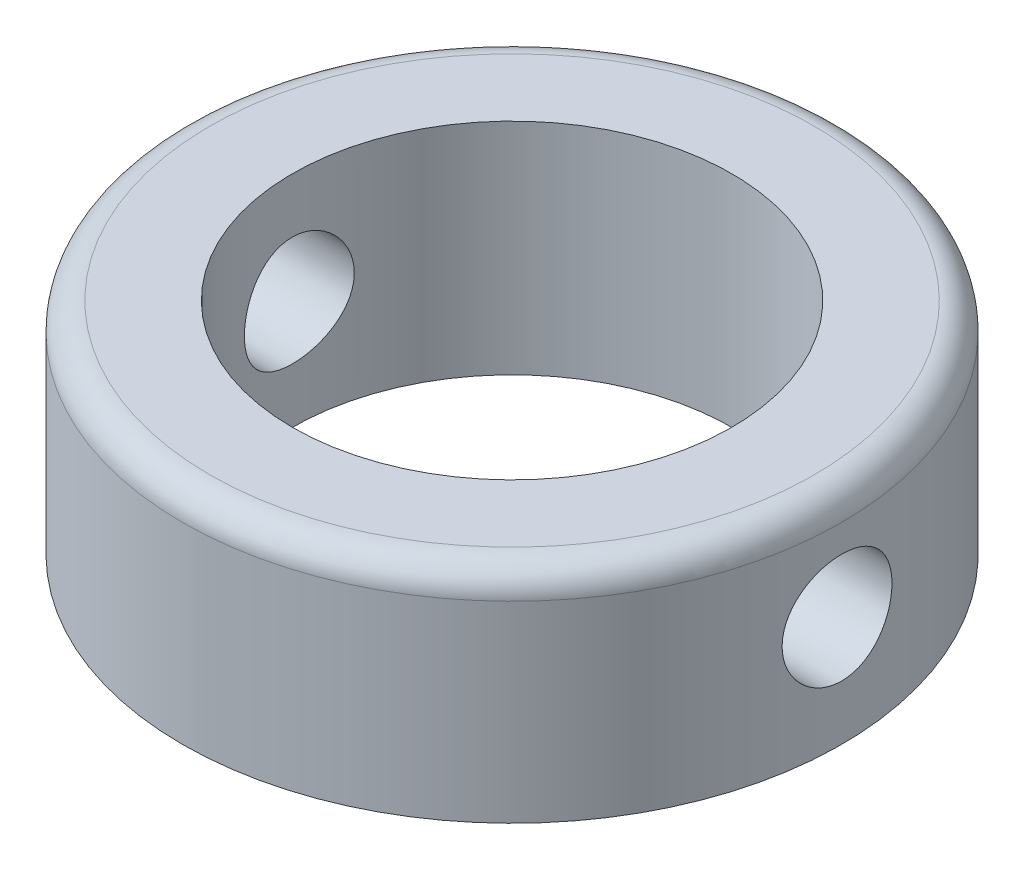
ISO-10303-21;
HEADER;
FILE_DESCRIPTION(('STEP AP214'),'2;1');
FILE_NAME('part.step','',(''),(''),'','','');
FILE_SCHEMA(('AUTOMOTIVE_DESIGN { 1 0 10303 214 1 1 1 1 }'));
ENDSEC;
DATA;
#1=APPLICATION_CONTEXT('core data for automotive mechanical design processes');
#2=APPLICATION_PROTOCOL_DEFINITION('international standard','automotive_design',2000,#1);
#3=PRODUCT_CONTEXT('',#1,'mechanical');
#4=PRODUCT('Part','Part','',(#3));
#5=PRODUCT_RELATED_PRODUCT_CATEGORY('part','',(#4));
#6=PRODUCT_DEFINITION_FORMATION('','',#4);
#7=PRODUCT_DEFINITION_CONTEXT('part definition',#1,'design');
#8=PRODUCT_DEFINITION('design','',#6,#7);
#9=PRODUCT_DEFINITION_SHAPE('','',#8);
#10=(LENGTH_UNIT() NAMED_UNIT(*) SI_UNIT(.MILLI.,.METRE.));
#11=(NAMED_UNIT(*) PLANE_ANGLE_UNIT() SI_UNIT($,.RADIAN.));
#12=(NAMED_UNIT(*) SI_UNIT($,.STERADIAN.) SOLID_ANGLE_UNIT());
#13=UNCERTAINTY_MEASURE_WITH_UNIT(LENGTH_MEASURE(1.E-05),#10,'distance_accuracy_value','');
#14=(GEOMETRIC_REPRESENTATION_CONTEXT(3) GLOBAL_UNCERTAINTY_ASSIGNED_CONTEXT((#13)) GLOBAL_UNIT_ASSIGNED_CONTEXT((#10,
#11,#12)) REPRESENTATION_CONTEXT('',''));
#15=CARTESIAN_POINT('',(0.,0.,0.));
#16=DIRECTION('',(0.,0.,1.));
#17=DIRECTION('',(1.,0.,0.));
#18=AXIS2_PLACEMENT_3D('',#15,#16,#17);
#19=CARTESIAN_POINT('',(0.,8.,0.));
#20=DIRECTION('',(0.,1.,0.));
#21=DIRECTION('',(0.,0.,1.));
#22=AXIS2_PLACEMENT_3D('',#19,#20,#21);
#23=PLANE('',#22);
#24=CARTESIAN_POINT('',(0.,8.,0.));
#25=DIRECTION('',(0.,1.,0.));
#26=DIRECTION('',(0.,0.,1.));
#27=AXIS2_PLACEMENT_3D('',#24,#25,#26);
#28=CIRCLE('',#27,11.);
#29=CARTESIAN_POINT('',(0.,8.,11.));
#30=VERTEX_POINT('',#29);
#31=EDGE_CURVE('E50',#30,#30,#28,.T.);
#32=ORIENTED_EDGE('',*,*,#31,.T.);
#33=EDGE_LOOP('',(#32));
#34=FACE_BOUND('',#33,.T.);
#35=CARTESIAN_POINT('',(0.,8.,0.));
#36=DIRECTION('',(0.,1.,0.));
#37=DIRECTION('',(0.,0.,1.));
#38=AXIS2_PLACEMENT_3D('',#35,#36,#37);
#39=CIRCLE('',#38,8.);
#40=CARTESIAN_POINT('',(0.,8.,8.));
#41=VERTEX_POINT('',#40);
#42=EDGE_CURVE('E104',#41,#41,#39,.T.);
#43=ORIENTED_EDGE('',*,*,#42,.F.);
#44=EDGE_LOOP('',(#43));
#45=FACE_BOUND('',#44,.T.);
#46=ADVANCED_FACE('F37',(#34,#45),#23,.T.);
#47=CARTESIAN_POINT('',(0.,0.,0.));
#48=DIRECTION('',(0.,1.,0.));
#49=DIRECTION('',(0.,0.,1.));
#50=AXIS2_PLACEMENT_3D('',#47,#48,#49);
#51=PLANE('',#50);
#52=CARTESIAN_POINT('',(0.,0.,0.));
#53=DIRECTION('',(0.,1.,0.));
#54=DIRECTION('',(0.,0.,1.));
#55=AXIS2_PLACEMENT_3D('',#52,#53,#54);
#56=CIRCLE('',#55,12.);
#57=CARTESIAN_POINT('',(0.,0.,12.));
#58=VERTEX_POINT('',#57);
#59=EDGE_CURVE('E55',#58,#58,#56,.T.);
#60=ORIENTED_EDGE('',*,*,#59,.F.);
#61=EDGE_LOOP('',(#60));
#62=FACE_BOUND('',#61,.T.);
#63=CARTESIAN_POINT('',(0.,0.,0.));
#64=DIRECTION('',(0.,1.,0.));
#65=DIRECTION('',(0.,0.,1.));
#66=AXIS2_PLACEMENT_3D('',#63,#64,#65);
#67=CIRCLE('',#66,8.);
#68=CARTESIAN_POINT('',(0.,0.,8.));
#69=VERTEX_POINT('',#68);
#70=EDGE_CURVE('E106',#69,#69,#67,.T.);
#71=ORIENTED_EDGE('',*,*,#70,.T.);
#72=EDGE_LOOP('',(#71));
#73=FACE_BOUND('',#72,.T.);
#74=ADVANCED_FACE('F90',(#62,#73),#51,.F.);
#75=CARTESIAN_POINT('',(0.,8.,0.));
#76=DIRECTION('',(0.,-1.,0.));
#77=DIRECTION('',(0.,0.,-1.));
#78=AXIS2_PLACEMENT_3D('',#75,#76,#77);
#79=CYLINDRICAL_SURFACE('',#78,12.);
#80=CARTESIAN_POINT('',(-12.,2.,0.));
#81=CARTESIAN_POINT('',(-11.9999980893506,2.00000447115825,-0.111512723966572));
#82=CARTESIAN_POINT('',(-11.9984294233043,2.00935781997514,-0.223086305471057));
#83=CARTESIAN_POINT('',(-11.9923227595311,2.04650852701226,-0.443104177338434));
#84=CARTESIAN_POINT('',(-11.9877820313911,2.07432284552928,-0.551545494367397));
#85=CARTESIAN_POINT('',(-11.9762405458916,2.1475323588742,-0.762083797770115));
#86=CARTESIAN_POINT('',(-11.9692418012735,2.19291317251246,-0.86418589474552));
#87=CARTESIAN_POINT('',(-11.9535538166566,2.29992983364192,-1.05931347358236));
#88=CARTESIAN_POINT('',(-11.9448647700355,2.3615638219864,-1.15233999190287));
#89=CARTESIAN_POINT('',(-11.9266665396665,2.49996406705637,-1.32757809143334));
#90=CARTESIAN_POINT('',(-11.9171509745189,2.5768552917089,-1.40969032282797));
#91=CARTESIAN_POINT('',(-11.8984210150139,2.74331837477825,-1.55991079892794));
#92=CARTESIAN_POINT('',(-11.8892066397013,2.83289103316529,-1.62801815951278));
#93=CARTESIAN_POINT('',(-11.8720605260782,3.02285677295764,-1.74869370048411));
#94=CARTESIAN_POINT('',(-11.8641370327331,3.1233130694438,-1.8011636422888));
#95=CARTESIAN_POINT('',(-11.8505583183574,3.3317676514405,-1.88844669232898));
#96=CARTESIAN_POINT('',(-11.8449029441145,3.4397654269421,-1.92326099325249));
#97=CARTESIAN_POINT('',(-11.836564294742,3.65918421988523,-1.97393150222785));
#98=CARTESIAN_POINT('',(-11.8338541478856,3.77056458920111,-1.98995922330832));
#99=CARTESIAN_POINT('',(-11.8316315114932,3.99446422150678,-2.0031333802319));
#100=CARTESIAN_POINT('',(-11.8321187956577,4.10698340333384,-2.0002811523112));
#101=CARTESIAN_POINT('',(-11.8362114309084,4.32874228902036,-1.97591607871692));
#102=CARTESIAN_POINT('',(-11.8397845865513,4.43800384283619,-1.95459590551182));
#103=CARTESIAN_POINT('',(-11.8495959616881,4.65137705426331,-1.89420251232276));
#104=CARTESIAN_POINT('',(-11.8558342725862,4.75548853511084,-1.85512868345579));
#105=CARTESIAN_POINT('',(-11.8703078346728,4.95618305875274,-1.76014179687513));
#106=CARTESIAN_POINT('',(-11.8785525368586,5.05272752486498,-1.70414873110377));
#107=CARTESIAN_POINT('',(-11.8961033473201,5.23512352043071,-1.57696961404595));
#108=CARTESIAN_POINT('',(-11.9054095412343,5.32097418596394,-1.50578233652343));
#109=CARTESIAN_POINT('',(-11.9241762230383,5.48066086864588,-1.34918576972724));
#110=CARTESIAN_POINT('',(-11.9336371938532,5.55433481483207,-1.2636111710985));
#111=CARTESIAN_POINT('',(-11.9515408111738,5.68630221013227,-1.08122819918532));
#112=CARTESIAN_POINT('',(-11.959983451118,5.74459556014658,-0.984419753525137));
#113=CARTESIAN_POINT('',(-11.9749111431433,5.84416178170903,-0.782164732933369));
#114=CARTESIAN_POINT('',(-11.9813945472596,5.885420335465,-0.676710980451729));
#115=CARTESIAN_POINT('',(-11.9916600241013,5.94959537219678,-0.460238676482185));
#116=CARTESIAN_POINT('',(-11.9954423228038,5.97251338957897,-0.349220591343574));
#117=CARTESIAN_POINT('',(-11.9998490387415,5.99913708676891,-0.126167921041299));
#118=CARTESIAN_POINT('',(-12.0005100241023,6.00306525744449,-0.0141605897208089));
#119=CARTESIAN_POINT('',(-11.9986997953694,5.9921909244575,0.20891181831191));
#120=CARTESIAN_POINT('',(-11.9962287017929,5.97738914149301,0.319976931113631));
#121=CARTESIAN_POINT('',(-11.9884546155056,5.92966012053162,0.537324940437411));
#122=CARTESIAN_POINT('',(-11.9831688384105,5.8968430332879,0.643632694708304));
#123=CARTESIAN_POINT('',(-11.9703557156429,5.81413238544037,0.849237507888354));
#124=CARTESIAN_POINT('',(-11.9628282440962,5.76423786589178,0.948534172727775));
#125=CARTESIAN_POINT('',(-11.9462761304193,5.64827910024257,1.13826455157517));
#126=CARTESIAN_POINT('',(-11.9372388470962,5.5820758750662,1.22861220074972));
#127=CARTESIAN_POINT('',(-11.9187077391352,5.43557014769195,1.39699486840215));
#128=CARTESIAN_POINT('',(-11.9092138813724,5.35526662137866,1.47502899175727));
#129=CARTESIAN_POINT('',(-11.8907214018868,5.18184196154286,1.6173942237264));
#130=CARTESIAN_POINT('',(-11.8817289290968,5.08859666758847,1.68157500889097));
#131=CARTESIAN_POINT('',(-11.8653722382231,4.89251762468917,1.79336184823599));
#132=CARTESIAN_POINT('',(-11.8580079685282,4.78968417981801,1.84096842781586));
#133=CARTESIAN_POINT('',(-11.8457876295816,4.57776821375029,1.91803066517852));
#134=CARTESIAN_POINT('',(-11.8409212344885,4.46871352397561,1.94756114603836));
#135=CARTESIAN_POINT('',(-11.8342217346821,4.24710389662259,1.98786836302262));
#136=CARTESIAN_POINT('',(-11.8323883662618,4.13454926421436,1.99864672955693));
#137=CARTESIAN_POINT('',(-11.8319738646721,3.91063586723007,2.00109829283788));
#138=CARTESIAN_POINT('',(-11.8333524520452,3.79927969713977,1.99300810890015));
#139=CARTESIAN_POINT('',(-11.8391182516298,3.57953660155939,1.95846387116548));
#140=CARTESIAN_POINT('',(-11.8435054540897,3.4711496664465,1.93200987688998));
#141=CARTESIAN_POINT('',(-11.8547788502538,3.26051325016591,1.86157959167592));
#142=CARTESIAN_POINT('',(-11.8616621377574,3.15825679195518,1.81762367248035));
#143=CARTESIAN_POINT('',(-11.8771549513777,2.96253146464412,1.71346160313273));
#144=CARTESIAN_POINT('',(-11.8857645631072,2.86906303170229,1.65325464699885));
#145=CARTESIAN_POINT('',(-11.903867632365,2.6923715335138,1.51745510749772));
#146=CARTESIAN_POINT('',(-11.9133703646104,2.60928318663978,1.44168845087492));
#147=CARTESIAN_POINT('',(-11.9321149788867,2.45691871642005,1.27728722510418));
#148=CARTESIAN_POINT('',(-11.9413568002124,2.38764578508946,1.18864969033011));
#149=CARTESIAN_POINT('',(-11.9586122371378,2.26444138544004,1.00029533571222));
#150=CARTESIAN_POINT('',(-11.9666169300248,2.21061916854964,0.900506230026254));
#151=CARTESIAN_POINT('',(-11.9804093408142,2.12058441231206,0.693210455503184));
#152=CARTESIAN_POINT('',(-11.9861992654199,2.08435433513624,0.585711595864007));
#153=CARTESIAN_POINT('',(-11.9936463266636,2.03839578069867,0.39816264803632));
#154=CARTESIAN_POINT('',(-11.9960162181869,2.02402042430723,0.319247064238758));
#155=CARTESIAN_POINT('',(-11.999193727889,2.0048210097242,0.160231448255847));
#156=CARTESIAN_POINT('',(-12.0000013729651,1.99999678709011,0.0801314364867953));
#157=CARTESIAN_POINT('',(-12.,2.,0.));
#158=B_SPLINE_CURVE_WITH_KNOTS('',3,(#80,#81,#82,#83,#84,#85,#86,#87,#88,#89,#90,#91,#92,#93,
#94,#95,#96,#97,#98,#99,#100,#101,#102,#103,#104,#105,#106,#107,#108,#109,#110,#111,#112,#113,
#114,#115,#116,#117,#118,#119,#120,#121,#122,#123,#124,#125,#126,#127,#128,#129,#130,#131,#132,
#133,#134,#135,#136,#137,#138,#139,#140,#141,#142,#143,#144,#145,#146,#147,#148,#149,#150,#151,
#152,#153,#154,#155,#156,#157),.UNSPECIFIED.,.T.,.F.,(4,2,2,2,2,2,2,2,2,2,2,2,2,2,2,2,2,2,2,2,2,
2,2,2,2,2,2,2,2,2,2,2,2,2,2,2,2,2,4),(0.,0.334245267950807,0.668798036556336,1.00307749362022,
1.33731873013983,1.67441992849866,2.01154240135885,2.35074016659072,2.68991501500945,
3.02596861682739,3.36199843456709,3.69456417408327,4.02714132020305,4.36131645306046,
4.69551856544459,5.03386215929061,5.37220793308678,5.71083751132723,6.04943875616919,
6.38406306793118,6.71867450428688,7.05126245605133,7.38386908660853,7.71941460501619,
8.05498450443427,8.39403057606095,8.73306589900755,9.07068817873418,9.40828110229294,
9.7416632761816,10.0750443695051,10.4080385458098,10.7410492402347,11.0780110735471,
11.4150506710318,11.7544178528576,12.0934460170406,12.3336339853121,12.5738178182157),.UNSPECIFIED.);
#159=CARTESIAN_POINT('',(-12.,2.,0.));
#160=VERTEX_POINT('',#159);
#161=EDGE_CURVE('E81',#160,#160,#158,.T.);
#162=ORIENTED_EDGE('',*,*,#161,.T.);
#163=EDGE_LOOP('',(#162));
#164=FACE_BOUND('',#163,.T.);
#165=CARTESIAN_POINT('',(11.8321595661992,4.,-2.));
#166=CARTESIAN_POINT('',(11.8321615789328,3.88849940147055,-1.99999551873586));
#167=CARTESIAN_POINT('',(11.8337527390819,3.77693791514282,-1.99064413522263));
#168=CARTESIAN_POINT('',(11.8399396576003,3.55694516538947,-1.9535019424531));
#169=CARTESIAN_POINT('',(11.844538186771,3.44851688499355,-1.92569412824689));
#170=CARTESIAN_POINT('',(11.8562048749385,3.23800617332672,-1.8525036349364));
#171=CARTESIAN_POINT('',(11.8632709694721,3.1359185210702,-1.80713564394559));
#172=CARTESIAN_POINT('',(11.8790741768183,2.94081523622578,-1.70014919751157));
#173=CARTESIAN_POINT('',(11.8878111015538,2.84779858433814,-1.63853257080106));
#174=CARTESIAN_POINT('',(11.906067769247,2.67254972020435,-1.50015002157323));
#175=CARTESIAN_POINT('',(11.9155937386236,2.59041989489103,-1.42325523914587));
#176=CARTESIAN_POINT('',(11.9342998453486,2.44016535451055,-1.25677760375622));
#177=CARTESIAN_POINT('',(11.9434799621739,2.37204146950767,-1.16719399931998));
#178=CARTESIAN_POINT('',(11.9605258958617,2.25134834622458,-0.977218295958686));
#179=CARTESIAN_POINT('',(11.9683835394587,2.19887439381456,-0.876764865165368));
#180=CARTESIAN_POINT('',(11.9818298956567,2.11158314357556,-0.668316497379095));
#181=CARTESIAN_POINT('',(11.9874187557813,2.0767646976921,-0.560322051262551));
#182=CARTESIAN_POINT('',(11.9956538777952,2.02608597201288,-0.340914981075394));
#183=CARTESIAN_POINT('',(11.9983268248873,2.01005366719625,-0.229543109343417));
#184=CARTESIAN_POINT('',(12.0005206347422,1.99686739667792,-0.00566022842063817));
#185=CARTESIAN_POINT('',(12.0000417117545,1.99971214780221,0.106850702823118));
#186=CARTESIAN_POINT('',(11.9960068674511,2.02406508122257,0.3286417480631));
#187=CARTESIAN_POINT('',(11.9924814695392,2.04538813072732,0.437942824560112));
#188=CARTESIAN_POINT('',(11.9827838301731,2.10580085939719,0.651393583689433));
#189=CARTESIAN_POINT('',(11.9766115081057,2.1448910796716,0.755543109321203));
#190=CARTESIAN_POINT('',(11.9622615880957,2.23991251225226,0.956284918226118));
#191=CARTESIAN_POINT('',(11.954074938615,2.29592000966595,1.05284041841524));
#192=CARTESIAN_POINT('',(11.936605904572,2.42313025810804,1.23525242387731));
#193=CARTESIAN_POINT('',(11.9273234313531,2.49433423896865,1.3211080623327));
#194=CARTESIAN_POINT('',(11.9085621458608,2.65094304529545,1.48077701875733));
#195=CARTESIAN_POINT('',(11.8990823178483,2.73650967592079,1.55443160180257));
#196=CARTESIAN_POINT('',(11.8811036782784,2.91886967217266,1.68636367075845));
#197=CARTESIAN_POINT('',(11.8726048757706,3.01566314134626,1.74464101482593));
#198=CARTESIAN_POINT('',(11.8575500364945,3.21791331350198,1.84419554759063));
#199=CARTESIAN_POINT('',(11.8509961864208,3.32337959847367,1.88545362182339));
#200=CARTESIAN_POINT('',(11.840609509519,3.53987925784603,1.94962389665249));
#201=CARTESIAN_POINT('',(11.8367764431066,3.65091214114594,1.97253771261436));
#202=CARTESIAN_POINT('',(11.8323116753769,3.87397292492971,1.99914550790341));
#203=CARTESIAN_POINT('',(11.8316422860694,3.98597310376168,2.00306576632995));
#204=CARTESIAN_POINT('',(11.8334802782589,4.20902933735266,1.99217816214597));
#205=CARTESIAN_POINT('',(11.8359875370548,4.32008542841118,1.97737102289973));
#206=CARTESIAN_POINT('',(11.8438614996401,4.53738220735269,1.92964186794248));
#207=CARTESIAN_POINT('',(11.8492100153468,4.64364891190241,1.89683503251711));
#208=CARTESIAN_POINT('',(11.862148584044,4.84917613302359,1.81415855215382));
#209=CARTESIAN_POINT('',(11.8697387711246,4.94843623004072,1.76428788648075));
#210=CARTESIAN_POINT('',(11.8863930271791,5.13813967552489,1.64836533858338));
#211=CARTESIAN_POINT('',(11.8954700448028,5.22849325820485,1.58216845132749));
#212=CARTESIAN_POINT('',(11.9140373334389,5.396890826156,1.43567157256639));
#213=CARTESIAN_POINT('',(11.9235276334827,5.47493394488779,1.35537058910724));
#214=CARTESIAN_POINT('',(11.9419713769461,5.61732151418296,1.18194245626305));
#215=CARTESIAN_POINT('',(11.9509182107574,5.68151506102763,1.08869060270896));
#216=CARTESIAN_POINT('',(11.9671608994635,5.7933242616039,0.892594758359461));
#217=CARTESIAN_POINT('',(11.9744568077598,5.84094045157908,0.789751077976502));
#218=CARTESIAN_POINT('',(11.9865468653567,5.91800846716389,0.577839241201063));
#219=CARTESIAN_POINT('',(11.9913518765409,5.94753926058794,0.46880045008209));
#220=CARTESIAN_POINT('',(11.9979646653543,5.98785247917106,0.24722458789937));
#221=CARTESIAN_POINT('',(11.9997726896015,5.99863644698588,0.134687805457297));
#222=CARTESIAN_POINT('',(12.0001843031025,6.00110550584976,-0.0892330206189404));
#223=CARTESIAN_POINT('',(11.9988264161935,5.99302020315287,-0.200614528482131));
#224=CARTESIAN_POINT('',(11.9931374270987,5.95847686218446,-0.420409579451763));
#225=CARTESIAN_POINT('',(11.9888063415615,5.93201892679226,-0.528823139173983));
#226=CARTESIAN_POINT('',(11.9776559106192,5.86156946756508,-0.73951715673483));
#227=CARTESIAN_POINT('',(11.970839336327,5.81759746543196,-0.841804297723056));
#228=CARTESIAN_POINT('',(11.9554620550242,5.71339365101553,-1.03758436238573));
#229=CARTESIAN_POINT('',(11.9469012653393,5.65316106795004,-1.13107686889458));
#230=CARTESIAN_POINT('',(11.9288610369313,5.5173319260316,-1.30777035642112));
#231=CARTESIAN_POINT('',(11.919372196329,5.441567236199,-1.3908411444822));
#232=CARTESIAN_POINT('',(11.900610426515,5.27717735367695,-1.54317110076073));
#233=CARTESIAN_POINT('',(11.8913375483961,5.18854915286998,-1.61242702936952));
#234=CARTESIAN_POINT('',(11.8739867482713,5.00020374200831,-1.73561141672869));
#235=CARTESIAN_POINT('',(11.8659177427663,4.90041252818761,-1.78942799124616));
#236=CARTESIAN_POINT('',(11.8519936807305,4.69311261132948,-1.87945162912342));
#237=CARTESIAN_POINT('',(11.846136413799,4.58561174185811,-1.91567628417846));
#238=CARTESIAN_POINT('',(11.8385979588519,4.39807698441009,-1.96162084250194));
#239=CARTESIAN_POINT('',(11.8361969873557,4.31917855362991,-1.97598993413711));
#240=CARTESIAN_POINT('',(11.8329770823046,4.16019721213045,-1.99518103614505));
#241=CARTESIAN_POINT('',(11.8321581200295,4.08011432294064,-2.00000321983422));
#242=CARTESIAN_POINT('',(11.8321595661992,4.,-2.));
#243=B_SPLINE_CURVE_WITH_KNOTS('',3,(#165,#166,#167,#168,#169,#170,#171,#172,#173,#174,#175,
#176,#177,#178,#179,#180,#181,#182,#183,#184,#185,#186,#187,#188,#189,#190,#191,#192,#193,#194,
#195,#196,#197,#198,#199,#200,#201,#202,#203,#204,#205,#206,#207,#208,#209,#210,#211,#212,#213,
#214,#215,#216,#217,#218,#219,#220,#221,#222,#223,#224,#225,#226,#227,#228,#229,#230,#231,#232,
#233,#234,#235,#236,#237,#238,#239,#240,#241,#242),.UNSPECIFIED.,.T.,.F.,(4,2,2,2,2,2,2,2,2,2,2,
2,2,2,2,2,2,2,2,2,2,2,2,2,2,2,2,2,2,2,2,2,2,2,2,2,2,2,4),(0.,0.334208831142192,
0.668726015970375,1.00296399830015,1.33716437924219,1.67431327324572,2.01148214267558,
2.35066384089148,2.6898234808889,3.02585253978052,3.36185875722154,3.69453696931735,
4.02722531399626,4.3614368331154,4.69567540981411,5.03396898769699,5.37226568596815,
5.71094129998883,6.04958708750462,6.38418833936328,6.71877666731181,7.05124851708393,
7.3837402583486,7.71929874210162,8.05488083544551,8.39395290428305,8.73301400381358,
9.07058387534117,9.40812596729881,9.74158221012733,10.0750365857506,10.4081203186597,
10.7412198431387,11.078135979706,11.4151310310545,11.7545098209466,12.0935485339556,
12.3336853643501,12.5738178352145),.UNSPECIFIED.);
#244=CARTESIAN_POINT('',(11.8321595661992,4.,-2.));
#245=VERTEX_POINT('',#244);
#246=EDGE_CURVE('E76',#245,#245,#243,.T.);
#247=ORIENTED_EDGE('',*,*,#246,.T.);
#248=EDGE_LOOP('',(#247));
#249=FACE_BOUND('',#248,.T.);
#250=CARTESIAN_POINT('',(0.,7.,0.));
#251=DIRECTION('',(0.,1.,0.));
#252=DIRECTION('',(0.,0.,1.));
#253=AXIS2_PLACEMENT_3D('',#250,#251,#252);
#254=CIRCLE('',#253,12.);
#255=CARTESIAN_POINT('',(0.,7.,12.));
#256=VERTEX_POINT('',#255);
#257=EDGE_CURVE('E10',#256,#256,#254,.F.);
#258=ORIENTED_EDGE('',*,*,#257,.T.);
#259=EDGE_LOOP('',(#258));
#260=FACE_BOUND('',#259,.T.);
#261=ORIENTED_EDGE('',*,*,#59,.T.);
#262=EDGE_LOOP('',(#261));
#263=FACE_BOUND('',#262,.T.);
#264=ADVANCED_FACE('F86',(#164,#249,#260,#263),#79,.T.);
#265=CARTESIAN_POINT('',(0.,8.,0.));
#266=DIRECTION('',(0.,-1.,0.));
#267=DIRECTION('',(0.,0.,-1.));
#268=AXIS2_PLACEMENT_3D('',#265,#266,#267);
#269=CYLINDRICAL_SURFACE('',#268,8.);
#270=CARTESIAN_POINT('',(-7.74596669241483,4.,-2.));
#271=CARTESIAN_POINT('',(-7.74596880070288,4.11044060074126,-1.99999686287446));
#272=CARTESIAN_POINT('',(-7.74835444811678,4.22091591894282,-1.99082099639812));
#273=CARTESIAN_POINT('',(-7.75761489594051,4.43869406253881,-1.95441850037103));
#274=CARTESIAN_POINT('',(-7.76449230897304,4.54599500357455,-1.92718136539368));
#275=CARTESIAN_POINT('',(-7.7819097967692,4.75424283054975,-1.85559295970563));
#276=CARTESIAN_POINT('',(-7.79244514152366,4.85519772430857,-1.81126378228359));
#277=CARTESIAN_POINT('',(-7.81598553623007,5.0482486820319,-1.70681691300911));
#278=CARTESIAN_POINT('',(-7.82899069102791,5.14034436966417,-1.64669855084855));
#279=CARTESIAN_POINT('',(-7.856325730845,5.31508931620977,-1.5109667418495));
#280=CARTESIAN_POINT('',(-7.87067678098427,5.39751488028004,-1.43506951016324));
#281=CARTESIAN_POINT('',(-7.89890300412235,5.54860911548827,-1.27054565128053));
#282=CARTESIAN_POINT('',(-7.91277813253111,5.6172765004974,-1.18191783534424));
#283=CARTESIAN_POINT('',(-7.93872332416466,5.73982037410502,-0.992916160863163));
#284=CARTESIAN_POINT('',(-7.95076549920474,5.79347711052917,-0.892395660956095));
#285=CARTESIAN_POINT('',(-7.97144649540787,5.88304771532247,-0.683410547434209));
#286=CARTESIAN_POINT('',(-7.98008581867475,5.91896420153241,-0.574947108633551));
#287=CARTESIAN_POINT('',(-7.99283807078544,5.97131826766287,-0.355487007003329));
#288=CARTESIAN_POINT('',(-7.99703915075451,5.98813571546127,-0.24458617563918));
#289=CARTESIAN_POINT('',(-8.00074875285838,6.00300670342044,-0.021463055410215));
#290=CARTESIAN_POINT('',(-8.00025796877363,6.00106301776768,0.0907590356304552));
#291=CARTESIAN_POINT('',(-7.99470475962828,5.97874011979988,0.310704494344775));
#292=CARTESIAN_POINT('',(-7.98974401872699,5.95877093995691,0.418472431202134));
#293=CARTESIAN_POINT('',(-7.97592669219883,5.9016229839612,0.629076494827373));
#294=CARTESIAN_POINT('',(-7.96706989918753,5.86444329169807,0.731912358740876));
#295=CARTESIAN_POINT('',(-7.94630007760717,5.77359794345035,0.930813407003613));
#296=CARTESIAN_POINT('',(-7.93436015756043,5.7197863642706,1.02680901953301));
#297=CARTESIAN_POINT('',(-7.90871923047719,5.59731545670699,1.20855124468098));
#298=CARTESIAN_POINT('',(-7.89501791721992,5.52865354515151,1.29429607017101));
#299=CARTESIAN_POINT('',(-7.86690971015616,5.3762330064141,1.45554807016991));
#300=CARTESIAN_POINT('',(-7.85249375620734,5.29211608612178,1.5307153581504));
#301=CARTESIAN_POINT('',(-7.82492034813365,5.1123200211678,1.66595275192604));
#302=CARTESIAN_POINT('',(-7.81176295284776,5.0166403364072,1.72602215209203));
#303=CARTESIAN_POINT('',(-7.78816397465319,4.81576797268083,1.82957625804519));
#304=CARTESIAN_POINT('',(-7.77773586980577,4.71053141574944,1.87297913394098));
#305=CARTESIAN_POINT('',(-7.76094912111966,4.49393162553884,1.94137124127268));
#306=CARTESIAN_POINT('',(-7.75458960648175,4.38256970881349,1.96636441310582));
#307=CARTESIAN_POINT('',(-7.74684284831312,4.1600323987815,1.99666371093214));
#308=CARTESIAN_POINT('',(-7.74532871274919,4.0489297653363,2.0024723791357));
#309=CARTESIAN_POINT('',(-7.74709874784831,3.82734245073747,1.99561359241244));
#310=CARTESIAN_POINT('',(-7.75038247681013,3.71685771363901,1.98294783827904));
#311=CARTESIAN_POINT('',(-7.76125665563648,3.50150858803623,1.93994037115013));
#312=CARTESIAN_POINT('',(-7.768775761875,3.39658181874333,1.9098912546254));
#313=CARTESIAN_POINT('',(-7.7872057461677,3.19325483371865,1.8332944653365));
#314=CARTESIAN_POINT('',(-7.79811702598891,3.09485539275573,1.78674483817004));
#315=CARTESIAN_POINT('',(-7.8223690967461,2.90524697770612,1.67741653434925));
#316=CARTESIAN_POINT('',(-7.83575334885313,2.81421692796552,1.6143374030685));
#317=CARTESIAN_POINT('',(-7.86333666457373,2.64384930975892,1.47412058586891));
#318=CARTESIAN_POINT('',(-7.87753586182776,2.56451366667994,1.39698058961088));
#319=CARTESIAN_POINT('',(-7.90557922425285,2.41775116594324,1.22852544196945));
#320=CARTESIAN_POINT('',(-7.91940561649468,2.35067194996095,1.13690390506319));
#321=CARTESIAN_POINT('',(-7.94477773290987,2.23285130643901,0.943405365389351));
#322=CARTESIAN_POINT('',(-7.95632357603169,2.18210902671344,0.841528897915182));
#323=CARTESIAN_POINT('',(-7.9757609259065,2.09884317237765,0.631116403462181));
#324=CARTESIAN_POINT('',(-7.98367864017925,2.06618857249675,0.522634762055764));
#325=CARTESIAN_POINT('',(-7.99508234716634,2.01963173231327,0.301499520637614));
#326=CARTESIAN_POINT('',(-7.99856919514738,2.00572587300877,0.188846730082481));
#327=CARTESIAN_POINT('',(-8.00068338817612,1.99726482084892,-0.0341670528866465));
#328=CARTESIAN_POINT('',(-7.99943957759977,2.00219658180918,-0.144507653932044));
#329=CARTESIAN_POINT('',(-7.99251792914887,2.0300956545887,-0.362734992829502));
#330=CARTESIAN_POINT('',(-7.98684022314338,2.05306243002634,-0.470621803561857));
#331=CARTESIAN_POINT('',(-7.97170865707778,2.11610443954172,-0.680342071289548));
#332=CARTESIAN_POINT('',(-7.96227529004785,2.15608690662876,-0.782204989161725));
#333=CARTESIAN_POINT('',(-7.94062577827316,2.25194115803914,-0.977834106083248));
#334=CARTESIAN_POINT('',(-7.92840928277515,2.30781494534097,-1.07159928253127));
#335=CARTESIAN_POINT('',(-7.90214499360574,2.43543046799227,-1.25080385684661));
#336=CARTESIAN_POINT('',(-7.88806033883329,2.50752028580766,-1.33598997659667));
#337=CARTESIAN_POINT('',(-7.85981298114379,2.66484570395469,-1.49323004054701));
#338=CARTESIAN_POINT('',(-7.84565025934604,2.75008463222233,-1.56528065015318));
#339=CARTESIAN_POINT('',(-7.81854951691005,2.93320282837892,-1.69552405294366));
#340=CARTESIAN_POINT('',(-7.80563927346578,3.03128824673051,-1.75343323883276));
#341=CARTESIAN_POINT('',(-7.78287910989656,3.23611097974964,-1.85185379317094));
#342=CARTESIAN_POINT('',(-7.77302696466427,3.34284193218769,-1.8923778195043));
#343=CARTESIAN_POINT('',(-7.75903817501475,3.54115402367032,-1.948845057142));
#344=CARTESIAN_POINT('',(-7.75417326006998,3.63178632877227,-1.96798634119376));
#345=CARTESIAN_POINT('',(-7.7476367716524,3.81493773799538,-1.99356458514354));
#346=CARTESIAN_POINT('',(-7.74596492578215,3.9074566804888,-2.0000026287435));
#347=CARTESIAN_POINT('',(-7.74596669241483,4.,-2.));
#348=B_SPLINE_CURVE_WITH_KNOTS('',3,(#270,#271,#272,#273,#274,#275,#276,#277,#278,#279,#280,
#281,#282,#283,#284,#285,#286,#287,#288,#289,#290,#291,#292,#293,#294,#295,#296,#297,#298,#299,
#300,#301,#302,#303,#304,#305,#306,#307,#308,#309,#310,#311,#312,#313,#314,#315,#316,#317,#318,
#319,#320,#321,#322,#323,#324,#325,#326,#327,#328,#329,#330,#331,#332,#333,#334,#335,#336,#337,
#338,#339,#340,#341,#342,#343,#344,#345,#346,#347),.UNSPECIFIED.,.T.,.F.,(4,2,2,2,2,2,2,2,2,2,2,
2,2,2,2,2,2,2,2,2,2,2,2,2,2,2,2,2,2,2,2,2,2,2,2,2,2,2,4),(0.,0.330981953388909,
0.662156593142933,0.992904581732815,1.32366661404383,1.66099163354381,1.99834817183893,
2.34041197118336,2.68242527877674,3.01751000796277,3.35254518932816,3.68014610151158,
4.00776445379829,4.33834299403555,4.6689790837513,5.00856373257529,5.34816424959841,
5.68941145606722,6.03058560103638,6.36274859809374,6.69488101747041,7.02157924007365,
7.34831617137134,7.68146276687326,8.01466415108036,8.35620264772255,8.69772332575642,
9.03673658245543,9.3756843912723,9.70546756901965,10.0352409390158,10.3632390124777,
10.6912784459046,11.0271767726566,11.3631602525241,11.7054118182895,12.0474137709606,
12.3247826174462,12.6021278008238),.UNSPECIFIED.);
#349=CARTESIAN_POINT('',(-7.74596669241483,4.,-2.));
#350=VERTEX_POINT('',#349);
#351=EDGE_CURVE('E41',#350,#350,#348,.T.);
#352=ORIENTED_EDGE('',*,*,#351,.F.);
#353=EDGE_LOOP('',(#352));
#354=FACE_BOUND('',#353,.T.);
#355=CARTESIAN_POINT('',(7.74596669241483,4.,-2.));
#356=CARTESIAN_POINT('',(7.74596880070288,3.88955939925874,-1.99999686287446));
#357=CARTESIAN_POINT('',(7.74835444811678,3.77908408105718,-1.99082099639812));
#358=CARTESIAN_POINT('',(7.75761489594051,3.56130593746119,-1.95441850037103));
#359=CARTESIAN_POINT('',(7.76449230897304,3.45400499642545,-1.92718136539368));
#360=CARTESIAN_POINT('',(7.7819097967692,3.24575716945026,-1.85559295970563));
#361=CARTESIAN_POINT('',(7.79244514152366,3.14480227569143,-1.81126378228359));
#362=CARTESIAN_POINT('',(7.81598553623007,2.9517513179681,-1.70681691300911));
#363=CARTESIAN_POINT('',(7.82899069102791,2.85965563033583,-1.64669855084855));
#364=CARTESIAN_POINT('',(7.856325730845,2.68491068379023,-1.51096674184951));
#365=CARTESIAN_POINT('',(7.87067678098427,2.60248511971996,-1.43506951016324));
#366=CARTESIAN_POINT('',(7.89890300412235,2.45139088451173,-1.27054565128053));
#367=CARTESIAN_POINT('',(7.91277813253111,2.3827234995026,-1.18191783534425));
#368=CARTESIAN_POINT('',(7.93872332416466,2.26017962589498,-0.992916160863166));
#369=CARTESIAN_POINT('',(7.95076549920474,2.20652288947083,-0.892395660956098));
#370=CARTESIAN_POINT('',(7.97144649540787,2.11695228467753,-0.683410547434211));
#371=CARTESIAN_POINT('',(7.98008581867475,2.08103579846759,-0.574947108633553));
#372=CARTESIAN_POINT('',(7.99283807078544,2.02868173233713,-0.35548700700333));
#373=CARTESIAN_POINT('',(7.99703915075451,2.01186428453873,-0.244586175639181));
#374=CARTESIAN_POINT('',(8.00074875285838,1.99699329657956,-0.0214630554102164));
#375=CARTESIAN_POINT('',(8.00025796877363,1.99893698223232,0.0907590356304539));
#376=CARTESIAN_POINT('',(7.99470475962828,2.02125988020012,0.310704494344773));
#377=CARTESIAN_POINT('',(7.98974401872699,2.04122906004309,0.418472431202133));
#378=CARTESIAN_POINT('',(7.97592669219883,2.0983770160388,0.629076494827372));
#379=CARTESIAN_POINT('',(7.96706989918753,2.13555670830193,0.731912358740875));
#380=CARTESIAN_POINT('',(7.94630007760717,2.22640205654965,0.930813407003613));
#381=CARTESIAN_POINT('',(7.93436015756043,2.2802136357294,1.02680901953301));
#382=CARTESIAN_POINT('',(7.90871923047719,2.40268454329301,1.20855124468098));
#383=CARTESIAN_POINT('',(7.89501791721992,2.4713464548485,1.29429607017101));
#384=CARTESIAN_POINT('',(7.86690971015616,2.6237669935859,1.45554807016991));
#385=CARTESIAN_POINT('',(7.85249375620734,2.70788391387822,1.5307153581504));
#386=CARTESIAN_POINT('',(7.82492034813365,2.8876799788322,1.66595275192604));
#387=CARTESIAN_POINT('',(7.81176295284776,2.9833596635928,1.72602215209203));
#388=CARTESIAN_POINT('',(7.78816397465319,3.18423202731917,1.8295762580452));
#389=CARTESIAN_POINT('',(7.77773586980577,3.28946858425056,1.87297913394098));
#390=CARTESIAN_POINT('',(7.76094912111966,3.50606837446116,1.94137124127268));
#391=CARTESIAN_POINT('',(7.75458960648175,3.61743029118651,1.96636441310582));
#392=CARTESIAN_POINT('',(7.74684284831312,3.8399676012185,1.99666371093214));
#393=CARTESIAN_POINT('',(7.74532871274918,3.9510702346637,2.0024723791357));
#394=CARTESIAN_POINT('',(7.74709874784832,4.17265754926253,1.99561359241244));
#395=CARTESIAN_POINT('',(7.75038247681013,4.28314228636099,1.98294783827904));
#396=CARTESIAN_POINT('',(7.76125665563648,4.49849141196377,1.93994037115013));
#397=CARTESIAN_POINT('',(7.768775761875,4.60341818125667,1.9098912546254));
#398=CARTESIAN_POINT('',(7.7872057461677,4.80674516628135,1.8332944653365));
#399=CARTESIAN_POINT('',(7.79811702598891,4.90514460724427,1.78674483817004));
#400=CARTESIAN_POINT('',(7.8223690967461,5.09475302229388,1.67741653434925));
#401=CARTESIAN_POINT('',(7.83575334885313,5.18578307203448,1.6143374030685));
#402=CARTESIAN_POINT('',(7.86333666457373,5.35615069024108,1.47412058586891));
#403=CARTESIAN_POINT('',(7.87753586182776,5.43548633332006,1.39698058961088));
#404=CARTESIAN_POINT('',(7.90557922425285,5.58224883405676,1.22852544196945));
#405=CARTESIAN_POINT('',(7.91940561649468,5.64932805003905,1.13690390506319));
#406=CARTESIAN_POINT('',(7.94477773290987,5.76714869356099,0.943405365389353));
#407=CARTESIAN_POINT('',(7.95632357603169,5.81789097328656,0.841528897915184));
#408=CARTESIAN_POINT('',(7.9757609259065,5.90115682762235,0.631116403462183));
#409=CARTESIAN_POINT('',(7.98367864017925,5.93381142750325,0.522634762055766));
#410=CARTESIAN_POINT('',(7.99508234716634,5.98036826768673,0.301499520637616));
#411=CARTESIAN_POINT('',(7.99856919514738,5.99427412699123,0.188846730082483));
#412=CARTESIAN_POINT('',(8.00068338817612,6.00273517915108,-0.0341670528866453));
#413=CARTESIAN_POINT('',(7.99943957759977,5.99780341819082,-0.144507653932043));
#414=CARTESIAN_POINT('',(7.99251792914887,5.9699043454113,-0.362734992829501));
#415=CARTESIAN_POINT('',(7.98684022314338,5.94693756997366,-0.470621803561857));
#416=CARTESIAN_POINT('',(7.97170865707778,5.88389556045828,-0.680342071289547));
#417=CARTESIAN_POINT('',(7.96227529004785,5.84391309337124,-0.782204989161724));
#418=CARTESIAN_POINT('',(7.94062577827316,5.74805884196086,-0.977834106083247));
#419=CARTESIAN_POINT('',(7.92840928277515,5.69218505465903,-1.07159928253127));
#420=CARTESIAN_POINT('',(7.90214499360574,5.56456953200773,-1.25080385684661));
#421=CARTESIAN_POINT('',(7.88806033883329,5.49247971419234,-1.33598997659667));
#422=CARTESIAN_POINT('',(7.85981298114379,5.33515429604531,-1.49323004054701));
#423=CARTESIAN_POINT('',(7.84565025934604,5.24991536777767,-1.56528065015318));
#424=CARTESIAN_POINT('',(7.81854951691005,5.06679717162108,-1.69552405294366));
#425=CARTESIAN_POINT('',(7.80563927346578,4.96871175326949,-1.75343323883276));
#426=CARTESIAN_POINT('',(7.78287910989656,4.76388902025036,-1.85185379317094));
#427=CARTESIAN_POINT('',(7.77302696466428,4.65715806781231,-1.8923778195043));
#428=CARTESIAN_POINT('',(7.75903817501475,4.45884597632968,-1.94884505714201));
#429=CARTESIAN_POINT('',(7.75417326006998,4.36821367122773,-1.96798634119376));
#430=CARTESIAN_POINT('',(7.7476367716524,4.18506226200462,-1.99356458514354));
#431=CARTESIAN_POINT('',(7.74596492578215,4.0925433195112,-2.0000026287435));
#432=CARTESIAN_POINT('',(7.74596669241483,4.,-2.));
#433=B_SPLINE_CURVE_WITH_KNOTS('',3,(#355,#356,#357,#358,#359,#360,#361,#362,#363,#364,#365,
#366,#367,#368,#369,#370,#371,#372,#373,#374,#375,#376,#377,#378,#379,#380,#381,#382,#383,#384,
#385,#386,#387,#388,#389,#390,#391,#392,#393,#394,#395,#396,#397,#398,#399,#400,#401,#402,#403,
#404,#405,#406,#407,#408,#409,#410,#411,#412,#413,#414,#415,#416,#417,#418,#419,#420,#421,#422,
#423,#424,#425,#426,#427,#428,#429,#430,#431,#432),.UNSPECIFIED.,.T.,.F.,(4,2,2,2,2,2,2,2,2,2,2,
2,2,2,2,2,2,2,2,2,2,2,2,2,2,2,2,2,2,2,2,2,2,2,2,2,2,2,4),(0.,0.330981953388909,
0.662156593142932,0.992904581732815,1.32366661404383,1.66099163354381,1.99834817183893,
2.34041197118336,2.68242527877674,3.01751000796277,3.35254518932816,3.68014610151157,
4.00776445379829,4.33834299403556,4.66897908375131,5.00856373257529,5.34816424959842,
5.68941145606722,6.03058560103638,6.36274859809374,6.69488101747042,7.02157924007365,
7.34831617137134,7.68146276687326,8.01466415108036,8.35620264772255,8.69772332575643,
9.03673658245543,9.37568439127231,9.70546756901966,10.0352409390158,10.3632390124777,
10.6912784459046,11.0271767726566,11.3631602525241,11.7054118182895,12.0474137709606,
12.3247826174462,12.6021278008238),.UNSPECIFIED.);
#434=CARTESIAN_POINT('',(7.74596669241483,4.,-2.));
#435=VERTEX_POINT('',#434);
#436=EDGE_CURVE('E58',#435,#435,#433,.T.);
#437=ORIENTED_EDGE('',*,*,#436,.F.);
#438=EDGE_LOOP('',(#437));
#439=FACE_BOUND('',#438,.T.);
#440=ORIENTED_EDGE('',*,*,#42,.T.);
#441=EDGE_LOOP('',(#440));
#442=FACE_BOUND('',#441,.T.);
#443=ORIENTED_EDGE('',*,*,#70,.F.);
#444=EDGE_LOOP('',(#443));
#445=FACE_BOUND('',#444,.T.);
#446=ADVANCED_FACE('F63',(#354,#439,#442,#445),#269,.F.);
#447=CARTESIAN_POINT('',(0.,7.,0.));
#448=DIRECTION('',(0.,1.,0.));
#449=DIRECTION('',(0.,0.,1.));
#450=AXIS2_PLACEMENT_3D('',#447,#448,#449);
#451=TOROIDAL_SURFACE('',#450,11.,1.);
#452=ORIENTED_EDGE('',*,*,#257,.F.);
#453=EDGE_LOOP('',(#452));
#454=FACE_BOUND('',#453,.T.);
#455=ORIENTED_EDGE('',*,*,#31,.F.);
#456=EDGE_LOOP('',(#455));
#457=FACE_BOUND('',#456,.T.);
#458=ADVANCED_FACE('F39',(#454,#457),#451,.T.);
#459=CARTESIAN_POINT('',(-12.,4.,0.));
#460=DIRECTION('',(1.,0.,0.));
#461=DIRECTION('',(0.,0.,-1.));
#462=AXIS2_PLACEMENT_3D('',#459,#460,#461);
#463=CYLINDRICAL_SURFACE('',#462,2.);
#464=ORIENTED_EDGE('',*,*,#436,.T.);
#465=EDGE_LOOP('',(#464));
#466=FACE_BOUND('',#465,.T.);
#467=ORIENTED_EDGE('',*,*,#246,.F.);
#468=EDGE_LOOP('',(#467));
#469=FACE_BOUND('',#468,.T.);
#470=ADVANCED_FACE('F69',(#466,#469),#463,.F.);
#471=ORIENTED_EDGE('',*,*,#351,.T.);
#472=EDGE_LOOP('',(#471));
#473=FACE_BOUND('',#472,.T.);
#474=ORIENTED_EDGE('',*,*,#161,.F.);
#475=EDGE_LOOP('',(#474));
#476=FACE_BOUND('',#475,.T.);
#477=ADVANCED_FACE('F66',(#473,#476),#463,.F.);
#478=CLOSED_SHELL('',(#46,#74,#264,#446,#458,#470,#477));
#479=MANIFOLD_SOLID_BREP('B2',#478);
#480=ADVANCED_BREP_SHAPE_REPRESENTATION('',(#18,#479),#14);
#481=SHAPE_DEFINITION_REPRESENTATION(#9,#480);
ENDSEC;
END-ISO-10303-21;
